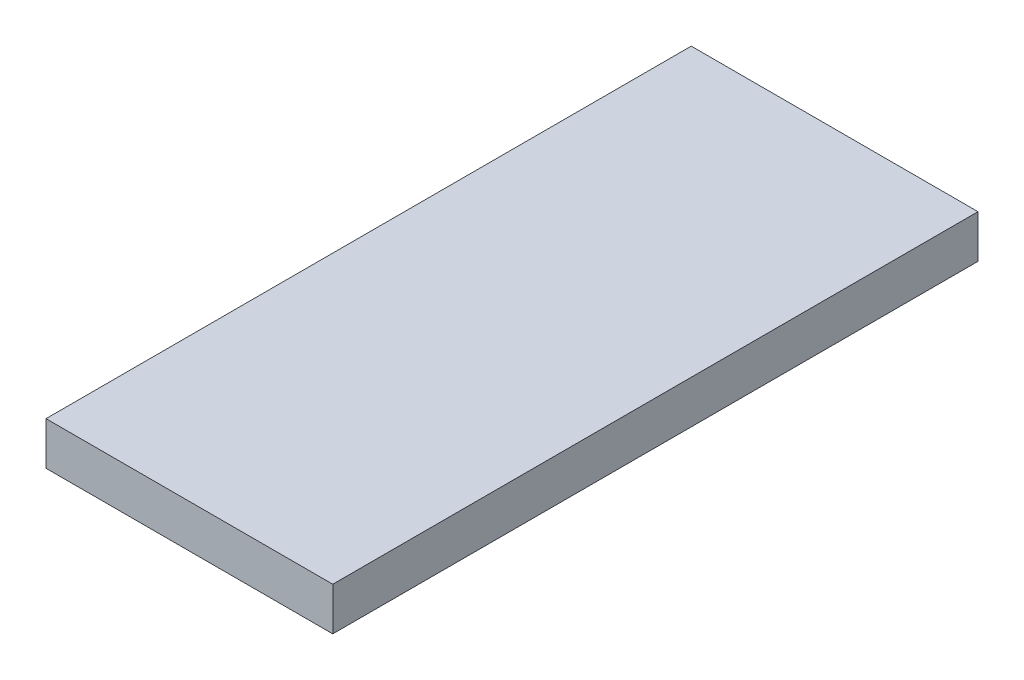
ISO-10303-21;
HEADER;
FILE_DESCRIPTION(('STEP AP214'),'2;1');
FILE_NAME('part.step','',(''),(''),'','','');
FILE_SCHEMA(('AUTOMOTIVE_DESIGN { 1 0 10303 214 1 1 1 1 }'));
ENDSEC;
DATA;
#1=APPLICATION_CONTEXT('core data for automotive mechanical design processes');
#2=APPLICATION_PROTOCOL_DEFINITION('international standard','automotive_design',2000,#1);
#3=PRODUCT_CONTEXT('',#1,'mechanical');
#4=PRODUCT('Part','Part','',(#3));
#5=PRODUCT_RELATED_PRODUCT_CATEGORY('part','',(#4));
#6=PRODUCT_DEFINITION_FORMATION('','',#4);
#7=PRODUCT_DEFINITION_CONTEXT('part definition',#1,'design');
#8=PRODUCT_DEFINITION('design','',#6,#7);
#9=PRODUCT_DEFINITION_SHAPE('','',#8);
#10=(LENGTH_UNIT() NAMED_UNIT(*) SI_UNIT(.MILLI.,.METRE.));
#11=(NAMED_UNIT(*) PLANE_ANGLE_UNIT() SI_UNIT($,.RADIAN.));
#12=(NAMED_UNIT(*) SI_UNIT($,.STERADIAN.) SOLID_ANGLE_UNIT());
#13=UNCERTAINTY_MEASURE_WITH_UNIT(LENGTH_MEASURE(1.E-05),#10,'distance_accuracy_value','');
#14=(GEOMETRIC_REPRESENTATION_CONTEXT(3) GLOBAL_UNCERTAINTY_ASSIGNED_CONTEXT((#13)) GLOBAL_UNIT_ASSIGNED_CONTEXT((#10,
#11,#12)) REPRESENTATION_CONTEXT('',''));
#15=CARTESIAN_POINT('',(0.,0.,0.));
#16=DIRECTION('',(0.,0.,1.));
#17=DIRECTION('',(1.,0.,0.));
#18=AXIS2_PLACEMENT_3D('',#15,#16,#17);
#19=CARTESIAN_POINT('',(0.,6.,0.));
#20=DIRECTION('',(1.,0.,0.));
#21=DIRECTION('',(0.,0.,-1.));
#22=AXIS2_PLACEMENT_3D('',#19,#20,#21);
#23=PLANE('',#22);
#24=DIRECTION('',(0.,0.,1.));
#25=VECTOR('',#24,1.);
#26=CARTESIAN_POINT('',(0.,0.,0.));
#27=LINE('',#26,#25);
#28=CARTESIAN_POINT('',(0.,0.,-90.));
#29=VERTEX_POINT('',#28);
#30=CARTESIAN_POINT('',(0.,0.,0.));
#31=VERTEX_POINT('',#30);
#32=EDGE_CURVE('E96',#29,#31,#27,.T.);
#33=ORIENTED_EDGE('',*,*,#32,.T.);
#34=DIRECTION('',(0.,-1.,0.));
#35=VECTOR('',#34,1.);
#36=CARTESIAN_POINT('',(0.,6.,0.));
#37=LINE('',#36,#35);
#38=CARTESIAN_POINT('',(0.,6.,0.));
#39=VERTEX_POINT('',#38);
#40=EDGE_CURVE('E11',#39,#31,#37,.T.);
#41=ORIENTED_EDGE('',*,*,#40,.F.);
#42=DIRECTION('',(0.,0.,1.));
#43=VECTOR('',#42,1.);
#44=CARTESIAN_POINT('',(0.,6.,0.));
#45=LINE('',#44,#43);
#46=CARTESIAN_POINT('',(0.,6.,-90.));
#47=VERTEX_POINT('',#46);
#48=EDGE_CURVE('E84',#47,#39,#45,.T.);
#49=ORIENTED_EDGE('',*,*,#48,.F.);
#50=DIRECTION('',(0.,-1.,0.));
#51=VECTOR('',#50,1.);
#52=CARTESIAN_POINT('',(0.,6.,-90.));
#53=LINE('',#52,#51);
#54=EDGE_CURVE('E92',#47,#29,#53,.T.);
#55=ORIENTED_EDGE('',*,*,#54,.T.);
#56=EDGE_LOOP('',(#33,#41,#49,#55));
#57=FACE_BOUND('',#56,.T.);
#58=ADVANCED_FACE('F33',(#57),#23,.F.);
#59=CARTESIAN_POINT('',(0.,6.,0.));
#60=DIRECTION('',(0.,0.,-1.));
#61=DIRECTION('',(-1.,0.,0.));
#62=AXIS2_PLACEMENT_3D('',#59,#60,#61);
#63=PLANE('',#62);
#64=DIRECTION('',(1.,0.,0.));
#65=VECTOR('',#64,1.);
#66=CARTESIAN_POINT('',(0.,0.,0.));
#67=LINE('',#66,#65);
#68=CARTESIAN_POINT('',(40.,0.,0.));
#69=VERTEX_POINT('',#68);
#70=EDGE_CURVE('E88',#31,#69,#67,.T.);
#71=ORIENTED_EDGE('',*,*,#70,.T.);
#72=DIRECTION('',(0.,-1.,0.));
#73=VECTOR('',#72,1.);
#74=CARTESIAN_POINT('',(40.,6.,0.));
#75=LINE('',#74,#73);
#76=CARTESIAN_POINT('',(40.,6.,0.));
#77=VERTEX_POINT('',#76);
#78=EDGE_CURVE('E41',#77,#69,#75,.T.);
#79=ORIENTED_EDGE('',*,*,#78,.F.);
#80=DIRECTION('',(1.,0.,0.));
#81=VECTOR('',#80,1.);
#82=CARTESIAN_POINT('',(0.,6.,0.));
#83=LINE('',#82,#81);
#84=EDGE_CURVE('E79',#39,#77,#83,.T.);
#85=ORIENTED_EDGE('',*,*,#84,.F.);
#86=ORIENTED_EDGE('',*,*,#40,.T.);
#87=EDGE_LOOP('',(#71,#79,#85,#86));
#88=FACE_BOUND('',#87,.T.);
#89=ADVANCED_FACE('F87',(#88),#63,.F.);
#90=CARTESIAN_POINT('',(40.,6.,0.));
#91=DIRECTION('',(-1.,0.,0.));
#92=DIRECTION('',(0.,0.,1.));
#93=AXIS2_PLACEMENT_3D('',#90,#91,#92);
#94=PLANE('',#93);
#95=DIRECTION('',(0.,0.,-1.));
#96=VECTOR('',#95,1.);
#97=CARTESIAN_POINT('',(40.,0.,0.));
#98=LINE('',#97,#96);
#99=CARTESIAN_POINT('',(40.,0.,-90.));
#100=VERTEX_POINT('',#99);
#101=EDGE_CURVE('E66',#69,#100,#98,.T.);
#102=ORIENTED_EDGE('',*,*,#101,.T.);
#103=DIRECTION('',(0.,-1.,0.));
#104=VECTOR('',#103,1.);
#105=CARTESIAN_POINT('',(40.,6.,-90.));
#106=LINE('',#105,#104);
#107=CARTESIAN_POINT('',(40.,6.,-90.));
#108=VERTEX_POINT('',#107);
#109=EDGE_CURVE('E89',#108,#100,#106,.T.);
#110=ORIENTED_EDGE('',*,*,#109,.F.);
#111=DIRECTION('',(0.,0.,-1.));
#112=VECTOR('',#111,1.);
#113=CARTESIAN_POINT('',(40.,6.,0.));
#114=LINE('',#113,#112);
#115=EDGE_CURVE('E82',#77,#108,#114,.T.);
#116=ORIENTED_EDGE('',*,*,#115,.F.);
#117=ORIENTED_EDGE('',*,*,#78,.T.);
#118=EDGE_LOOP('',(#102,#110,#116,#117));
#119=FACE_BOUND('',#118,.T.);
#120=ADVANCED_FACE('F90',(#119),#94,.F.);
#121=CARTESIAN_POINT('',(0.,6.,-90.));
#122=DIRECTION('',(0.,0.,1.));
#123=DIRECTION('',(1.,0.,0.));
#124=AXIS2_PLACEMENT_3D('',#121,#122,#123);
#125=PLANE('',#124);
#126=DIRECTION('',(-1.,0.,0.));
#127=VECTOR('',#126,1.);
#128=CARTESIAN_POINT('',(0.,0.,-90.));
#129=LINE('',#128,#127);
#130=EDGE_CURVE('E72',#100,#29,#129,.T.);
#131=ORIENTED_EDGE('',*,*,#130,.T.);
#132=ORIENTED_EDGE('',*,*,#54,.F.);
#133=DIRECTION('',(-1.,0.,0.));
#134=VECTOR('',#133,1.);
#135=CARTESIAN_POINT('',(0.,6.,-90.));
#136=LINE('',#135,#134);
#137=EDGE_CURVE('E49',#108,#47,#136,.T.);
#138=ORIENTED_EDGE('',*,*,#137,.F.);
#139=ORIENTED_EDGE('',*,*,#109,.T.);
#140=EDGE_LOOP('',(#131,#132,#138,#139));
#141=FACE_BOUND('',#140,.T.);
#142=ADVANCED_FACE('F103',(#141),#125,.F.);
#143=CARTESIAN_POINT('',(0.,6.,0.));
#144=DIRECTION('',(0.,-1.,0.));
#145=DIRECTION('',(0.,0.,-1.));
#146=AXIS2_PLACEMENT_3D('',#143,#144,#145);
#147=PLANE('',#146);
#148=ORIENTED_EDGE('',*,*,#48,.T.);
#149=ORIENTED_EDGE('',*,*,#84,.T.);
#150=ORIENTED_EDGE('',*,*,#115,.T.);
#151=ORIENTED_EDGE('',*,*,#137,.T.);
#152=EDGE_LOOP('',(#148,#149,#150,#151));
#153=FACE_BOUND('',#152,.T.);
#154=ADVANCED_FACE('F80',(#153),#147,.F.);
#155=CARTESIAN_POINT('',(0.,0.,0.));
#156=DIRECTION('',(0.,-1.,0.));
#157=DIRECTION('',(0.,0.,-1.));
#158=AXIS2_PLACEMENT_3D('',#155,#156,#157);
#159=PLANE('',#158);
#160=ORIENTED_EDGE('',*,*,#32,.F.);
#161=ORIENTED_EDGE('',*,*,#130,.F.);
#162=ORIENTED_EDGE('',*,*,#101,.F.);
#163=ORIENTED_EDGE('',*,*,#70,.F.);
#164=EDGE_LOOP('',(#160,#161,#162,#163));
#165=FACE_BOUND('',#164,.T.);
#166=ADVANCED_FACE('F106',(#165),#159,.T.);
#167=CLOSED_SHELL('',(#58,#89,#120,#142,#154,#166));
#168=MANIFOLD_SOLID_BREP('B2',#167);
#169=ADVANCED_BREP_SHAPE_REPRESENTATION('',(#18,#168),#14);
#170=SHAPE_DEFINITION_REPRESENTATION(#9,#169);
ENDSEC;
END-ISO-10303-21;
